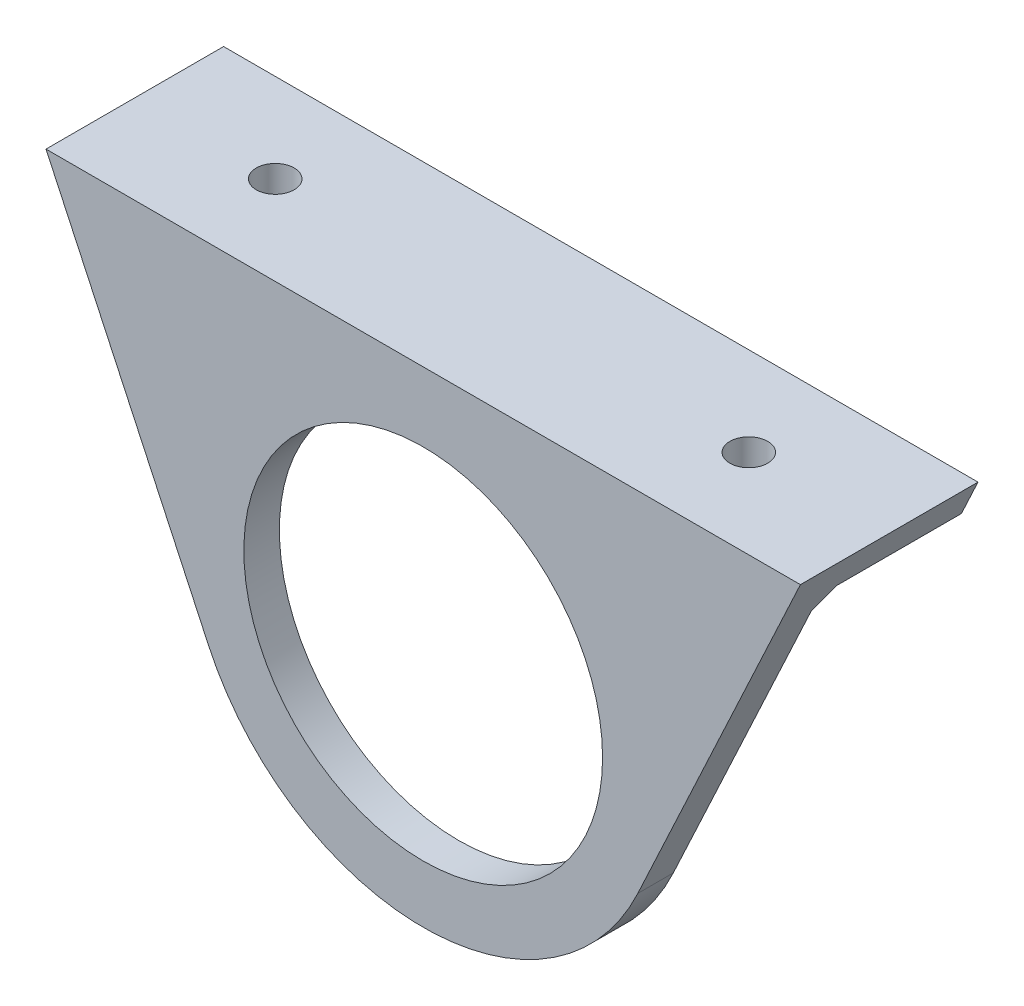
ISO-10303-21;
HEADER;
FILE_DESCRIPTION(('STEP AP214'),'2;1');
FILE_NAME('part.step','',(''),(''),'','','');
FILE_SCHEMA(('AUTOMOTIVE_DESIGN { 1 0 10303 214 1 1 1 1 }'));
ENDSEC;
DATA;
#1=APPLICATION_CONTEXT('core data for automotive mechanical design processes');
#2=APPLICATION_PROTOCOL_DEFINITION('international standard','automotive_design',2000,#1);
#3=PRODUCT_CONTEXT('',#1,'mechanical');
#4=PRODUCT('Part','Part','',(#3));
#5=PRODUCT_RELATED_PRODUCT_CATEGORY('part','',(#4));
#6=PRODUCT_DEFINITION_FORMATION('','',#4);
#7=PRODUCT_DEFINITION_CONTEXT('part definition',#1,'design');
#8=PRODUCT_DEFINITION('design','',#6,#7);
#9=PRODUCT_DEFINITION_SHAPE('','',#8);
#10=(LENGTH_UNIT() NAMED_UNIT(*) SI_UNIT(.MILLI.,.METRE.));
#11=(NAMED_UNIT(*) PLANE_ANGLE_UNIT() SI_UNIT($,.RADIAN.));
#12=(NAMED_UNIT(*) SI_UNIT($,.STERADIAN.) SOLID_ANGLE_UNIT());
#13=UNCERTAINTY_MEASURE_WITH_UNIT(LENGTH_MEASURE(1.E-05),#10,'distance_accuracy_value','');
#14=(GEOMETRIC_REPRESENTATION_CONTEXT(3) GLOBAL_UNCERTAINTY_ASSIGNED_CONTEXT((#13)) GLOBAL_UNIT_ASSIGNED_CONTEXT((#10,
#11,#12)) REPRESENTATION_CONTEXT('',''));
#15=CARTESIAN_POINT('',(0.,0.,0.));
#16=DIRECTION('',(0.,0.,1.));
#17=DIRECTION('',(1.,0.,0.));
#18=AXIS2_PLACEMENT_3D('',#15,#16,#17);
#19=CARTESIAN_POINT('',(0.,0.,15.));
#20=DIRECTION('',(0.,0.,1.));
#21=DIRECTION('',(1.,0.,0.));
#22=AXIS2_PLACEMENT_3D('',#19,#20,#21);
#23=PLANE('',#22);
#24=CARTESIAN_POINT('',(0.,0.,15.));
#25=DIRECTION('',(0.,0.,1.));
#26=DIRECTION('',(1.,0.,0.));
#27=AXIS2_PLACEMENT_3D('',#24,#25,#26);
#28=CIRCLE('',#27,20.);
#29=CARTESIAN_POINT('',(-18.126155740733,-8.45236523481408,15.));
#30=VERTEX_POINT('',#29);
#31=CARTESIAN_POINT('',(18.126155740733,-8.45236523481408,15.));
#32=VERTEX_POINT('',#31);
#33=EDGE_CURVE('E129',#30,#32,#28,.T.);
#34=ORIENTED_EDGE('',*,*,#33,.T.);
#35=DIRECTION('',(0.422618261740704,0.906307787036648,0.));
#36=VECTOR('',#35,1.);
#37=CARTESIAN_POINT('',(18.126155740733,-8.45236523481408,15.));
#38=LINE('',#37,#36);
#39=CARTESIAN_POINT('',(31.860019200505,21.,15.));
#40=VERTEX_POINT('',#39);
#41=EDGE_CURVE('E178',#32,#40,#38,.T.);
#42=ORIENTED_EDGE('',*,*,#41,.T.);
#43=DIRECTION('',(-1.,0.,0.));
#44=VECTOR('',#43,1.);
#45=CARTESIAN_POINT('',(-31.860019200505,21.,15.));
#46=LINE('',#45,#44);
#47=CARTESIAN_POINT('',(-31.860019200505,21.,15.));
#48=VERTEX_POINT('',#47);
#49=EDGE_CURVE('E139',#40,#48,#46,.T.);
#50=ORIENTED_EDGE('',*,*,#49,.T.);
#51=DIRECTION('',(0.422618261740704,-0.906307787036648,0.));
#52=VECTOR('',#51,1.);
#53=CARTESIAN_POINT('',(-18.126155740733,-8.45236523481408,15.));
#54=LINE('',#53,#52);
#55=EDGE_CURVE('E132',#48,#30,#54,.T.);
#56=ORIENTED_EDGE('',*,*,#55,.T.);
#57=EDGE_LOOP('',(#34,#42,#50,#56));
#58=FACE_BOUND('',#57,.T.);
#59=CARTESIAN_POINT('',(0.,0.,15.));
#60=DIRECTION('',(0.,0.,1.));
#61=DIRECTION('',(1.,0.,0.));
#62=AXIS2_PLACEMENT_3D('',#59,#60,#61);
#63=CIRCLE('',#62,15.15);
#64=CARTESIAN_POINT('',(15.15,0.,15.));
#65=VERTEX_POINT('',#64);
#66=EDGE_CURVE('E169',#65,#65,#63,.T.);
#67=ORIENTED_EDGE('',*,*,#66,.F.);
#68=EDGE_LOOP('',(#67));
#69=FACE_BOUND('',#68,.T.);
#70=ADVANCED_FACE('F45',(#58,#69),#23,.T.);
#71=CARTESIAN_POINT('',(0.,0.,0.));
#72=DIRECTION('',(0.,0.,1.));
#73=DIRECTION('',(1.,0.,0.));
#74=AXIS2_PLACEMENT_3D('',#71,#72,#73);
#75=PLANE('',#74);
#76=DIRECTION('',(0.422618261740704,0.906307787036648,0.));
#77=VECTOR('',#76,1.);
#78=CARTESIAN_POINT('',(18.126155740733,-8.45236523481408,0.));
#79=LINE('',#78,#77);
#80=CARTESIAN_POINT('',(30.46109622604,18.,0.));
#81=VERTEX_POINT('',#80);
#82=CARTESIAN_POINT('',(31.860019200505,21.,0.));
#83=VERTEX_POINT('',#82);
#84=EDGE_CURVE('E175',#81,#83,#79,.T.);
#85=ORIENTED_EDGE('',*,*,#84,.F.);
#86=DIRECTION('',(1.,0.,0.));
#87=VECTOR('',#86,1.);
#88=CARTESIAN_POINT('',(-35.,18.,0.));
#89=LINE('',#88,#87);
#90=CARTESIAN_POINT('',(-30.46109622604,18.,0.));
#91=VERTEX_POINT('',#90);
#92=EDGE_CURVE('E155',#91,#81,#89,.T.);
#93=ORIENTED_EDGE('',*,*,#92,.F.);
#94=DIRECTION('',(0.422618261740704,-0.906307787036648,0.));
#95=VECTOR('',#94,1.);
#96=CARTESIAN_POINT('',(-18.126155740733,-8.45236523481408,0.));
#97=LINE('',#96,#95);
#98=CARTESIAN_POINT('',(-31.860019200505,21.,0.));
#99=VERTEX_POINT('',#98);
#100=EDGE_CURVE('E142',#99,#91,#97,.T.);
#101=ORIENTED_EDGE('',*,*,#100,.F.);
#102=DIRECTION('',(-1.,0.,0.));
#103=VECTOR('',#102,1.);
#104=CARTESIAN_POINT('',(-31.860019200505,21.,0.));
#105=LINE('',#104,#103);
#106=EDGE_CURVE('E184',#83,#99,#105,.T.);
#107=ORIENTED_EDGE('',*,*,#106,.F.);
#108=EDGE_LOOP('',(#85,#93,#101,#107));
#109=FACE_BOUND('',#108,.T.);
#110=ADVANCED_FACE('F195',(#109),#75,.F.);
#111=CARTESIAN_POINT('',(0.,0.,15.));
#112=DIRECTION('',(0.,0.,-1.));
#113=DIRECTION('',(-1.,0.,0.));
#114=AXIS2_PLACEMENT_3D('',#111,#112,#113);
#115=CYLINDRICAL_SURFACE('',#114,20.);
#116=DIRECTION('',(0.,0.,-1.));
#117=VECTOR('',#116,1.);
#118=CARTESIAN_POINT('',(-18.126155740733,-8.45236523481408,15.));
#119=LINE('',#118,#117);
#120=CARTESIAN_POINT('',(-18.126155740733,-8.45236523481408,12.));
#121=VERTEX_POINT('',#120);
#122=EDGE_CURVE('E109',#30,#121,#119,.T.);
#123=ORIENTED_EDGE('',*,*,#122,.T.);
#124=CARTESIAN_POINT('',(0.,0.,12.));
#125=DIRECTION('',(0.,0.,1.));
#126=DIRECTION('',(0.,-1.,0.));
#127=AXIS2_PLACEMENT_3D('',#124,#125,#126);
#128=CIRCLE('',#127,20.);
#129=CARTESIAN_POINT('',(18.126155740733,-8.45236523481408,12.));
#130=VERTEX_POINT('',#129);
#131=EDGE_CURVE('E116',#121,#130,#128,.T.);
#132=ORIENTED_EDGE('',*,*,#131,.T.);
#133=DIRECTION('',(0.,0.,-1.));
#134=VECTOR('',#133,1.);
#135=CARTESIAN_POINT('',(18.126155740733,-8.45236523481408,15.));
#136=LINE('',#135,#134);
#137=EDGE_CURVE('E148',#32,#130,#136,.T.);
#138=ORIENTED_EDGE('',*,*,#137,.F.);
#139=ORIENTED_EDGE('',*,*,#33,.F.);
#140=EDGE_LOOP('',(#123,#132,#138,#139));
#141=FACE_BOUND('',#140,.T.);
#142=ADVANCED_FACE('F127',(#141),#115,.T.);
#143=CARTESIAN_POINT('',(18.126155740733,-8.45236523481408,15.));
#144=DIRECTION('',(-0.906307787036648,0.422618261740704,0.));
#145=DIRECTION('',(-0.422618261740704,-0.906307787036648,0.));
#146=AXIS2_PLACEMENT_3D('',#143,#144,#145);
#147=PLANE('',#146);
#148=ORIENTED_EDGE('',*,*,#137,.T.);
#149=DIRECTION('',(0.422618261740704,0.906307787036648,0.));
#150=VECTOR('',#149,1.);
#151=CARTESIAN_POINT('',(18.126155740733,-8.45236523481408,12.));
#152=LINE('',#151,#150);
#153=CARTESIAN_POINT('',(29.7616347388075,16.5,12.));
#154=VERTEX_POINT('',#153);
#155=EDGE_CURVE('E121',#130,#154,#152,.T.);
#156=ORIENTED_EDGE('',*,*,#155,.T.);
#157=DIRECTION('',(-0.31314561301498,-0.671542934237823,0.67154293423781));
#158=VECTOR('',#157,1.);
#159=CARTESIAN_POINT('',(22.7425345152546,1.44749099484088,27.0525090051588));
#160=LINE('',#159,#158);
#161=CARTESIAN_POINT('',(30.46109622604,18.,10.5));
#162=VERTEX_POINT('',#161);
#163=EDGE_CURVE('E55',#154,#162,#160,.F.);
#164=ORIENTED_EDGE('',*,*,#163,.T.);
#165=DIRECTION('',(0.,0.,-1.));
#166=VECTOR('',#165,1.);
#167=CARTESIAN_POINT('',(30.46109622604,18.,15.));
#168=LINE('',#167,#166);
#169=EDGE_CURVE('E166',#162,#81,#168,.T.);
#170=ORIENTED_EDGE('',*,*,#169,.T.);
#171=ORIENTED_EDGE('',*,*,#84,.T.);
#172=DIRECTION('',(0.,0.,-1.));
#173=VECTOR('',#172,1.);
#174=CARTESIAN_POINT('',(31.860019200505,21.,15.));
#175=LINE('',#174,#173);
#176=EDGE_CURVE('E137',#40,#83,#175,.T.);
#177=ORIENTED_EDGE('',*,*,#176,.F.);
#178=ORIENTED_EDGE('',*,*,#41,.F.);
#179=EDGE_LOOP('',(#148,#156,#164,#170,#171,#177,#178));
#180=FACE_BOUND('',#179,.T.);
#181=ADVANCED_FACE('F164',(#180),#147,.F.);
#182=CARTESIAN_POINT('',(-31.860019200505,21.,15.));
#183=DIRECTION('',(0.,-1.,0.));
#184=DIRECTION('',(0.,0.,-1.));
#185=AXIS2_PLACEMENT_3D('',#182,#183,#184);
#186=PLANE('',#185);
#187=CARTESIAN_POINT('',(-20.,21.,7.5));
#188=DIRECTION('',(0.,1.,0.));
#189=DIRECTION('',(0.,0.,1.));
#190=AXIS2_PLACEMENT_3D('',#187,#188,#189);
#191=CIRCLE('',#190,1.6);
#192=CARTESIAN_POINT('',(-20.,21.,9.1));
#193=VERTEX_POINT('',#192);
#194=EDGE_CURVE('E202',#193,#193,#191,.T.);
#195=ORIENTED_EDGE('',*,*,#194,.F.);
#196=EDGE_LOOP('',(#195));
#197=FACE_BOUND('',#196,.T.);
#198=CARTESIAN_POINT('',(20.,21.,7.5));
#199=DIRECTION('',(0.,1.,0.));
#200=DIRECTION('',(0.,0.,1.));
#201=AXIS2_PLACEMENT_3D('',#198,#199,#200);
#202=CIRCLE('',#201,1.6);
#203=CARTESIAN_POINT('',(20.,21.,9.1));
#204=VERTEX_POINT('',#203);
#205=EDGE_CURVE('E205',#204,#204,#202,.T.);
#206=ORIENTED_EDGE('',*,*,#205,.F.);
#207=EDGE_LOOP('',(#206));
#208=FACE_BOUND('',#207,.T.);
#209=ORIENTED_EDGE('',*,*,#106,.T.);
#210=DIRECTION('',(0.,0.,-1.));
#211=VECTOR('',#210,1.);
#212=CARTESIAN_POINT('',(-31.860019200505,21.,15.));
#213=LINE('',#212,#211);
#214=EDGE_CURVE('E131',#48,#99,#213,.T.);
#215=ORIENTED_EDGE('',*,*,#214,.F.);
#216=ORIENTED_EDGE('',*,*,#49,.F.);
#217=ORIENTED_EDGE('',*,*,#176,.T.);
#218=EDGE_LOOP('',(#209,#215,#216,#217));
#219=FACE_BOUND('',#218,.T.);
#220=ADVANCED_FACE('F220',(#197,#208,#219),#186,.F.);
#221=CARTESIAN_POINT('',(-18.126155740733,-8.45236523481408,15.));
#222=DIRECTION('',(0.906307787036648,0.422618261740704,0.));
#223=DIRECTION('',(-0.422618261740704,0.906307787036648,0.));
#224=AXIS2_PLACEMENT_3D('',#221,#222,#223);
#225=PLANE('',#224);
#226=DIRECTION('',(0.,0.,1.));
#227=VECTOR('',#226,1.);
#228=CARTESIAN_POINT('',(-30.46109622604,18.,15.));
#229=LINE('',#228,#227);
#230=CARTESIAN_POINT('',(-30.46109622604,18.,10.5));
#231=VERTEX_POINT('',#230);
#232=EDGE_CURVE('E151',#91,#231,#229,.T.);
#233=ORIENTED_EDGE('',*,*,#232,.T.);
#234=DIRECTION('',(-0.31314561301498,0.671542934237823,-0.67154293423781));
#235=VECTOR('',#234,1.);
#236=CARTESIAN_POINT('',(-22.7425345152546,1.44749099484088,27.0525090051588));
#237=LINE('',#236,#235);
#238=CARTESIAN_POINT('',(-29.7616347388075,16.5,12.));
#239=VERTEX_POINT('',#238);
#240=EDGE_CURVE('E11',#231,#239,#237,.F.);
#241=ORIENTED_EDGE('',*,*,#240,.T.);
#242=DIRECTION('',(0.422618261740704,-0.906307787036648,0.));
#243=VECTOR('',#242,1.);
#244=CARTESIAN_POINT('',(-18.126155740733,-8.45236523481408,12.));
#245=LINE('',#244,#243);
#246=EDGE_CURVE('E104',#239,#121,#245,.T.);
#247=ORIENTED_EDGE('',*,*,#246,.T.);
#248=ORIENTED_EDGE('',*,*,#122,.F.);
#249=ORIENTED_EDGE('',*,*,#55,.F.);
#250=ORIENTED_EDGE('',*,*,#214,.T.);
#251=ORIENTED_EDGE('',*,*,#100,.T.);
#252=EDGE_LOOP('',(#233,#241,#247,#248,#249,#250,#251));
#253=FACE_BOUND('',#252,.T.);
#254=ADVANCED_FACE('F106',(#253),#225,.F.);
#255=CARTESIAN_POINT('',(0.,0.,15.));
#256=DIRECTION('',(0.,0.,-1.));
#257=DIRECTION('',(-1.,0.,0.));
#258=AXIS2_PLACEMENT_3D('',#255,#256,#257);
#259=CYLINDRICAL_SURFACE('',#258,15.15);
#260=CARTESIAN_POINT('',(0.,0.,12.));
#261=DIRECTION('',(0.,0.,1.));
#262=DIRECTION('',(0.,-1.,0.));
#263=AXIS2_PLACEMENT_3D('',#260,#261,#262);
#264=CIRCLE('',#263,15.15);
#265=CARTESIAN_POINT('',(0.,-15.15,12.));
#266=VERTEX_POINT('',#265);
#267=EDGE_CURVE('E117',#266,#266,#264,.T.);
#268=ORIENTED_EDGE('',*,*,#267,.F.);
#269=EDGE_LOOP('',(#268));
#270=FACE_BOUND('',#269,.T.);
#271=ORIENTED_EDGE('',*,*,#66,.T.);
#272=EDGE_LOOP('',(#271));
#273=FACE_BOUND('',#272,.T.);
#274=ADVANCED_FACE('F234',(#270,#273),#259,.F.);
#275=CARTESIAN_POINT('',(-35.,18.,0.));
#276=DIRECTION('',(0.,1.,0.));
#277=DIRECTION('',(0.,0.,1.));
#278=AXIS2_PLACEMENT_3D('',#275,#276,#277);
#279=PLANE('',#278);
#280=CARTESIAN_POINT('',(-20.,18.,7.5));
#281=DIRECTION('',(0.,1.,0.));
#282=DIRECTION('',(0.,0.,1.));
#283=AXIS2_PLACEMENT_3D('',#280,#281,#282);
#284=CIRCLE('',#283,1.6);
#285=CARTESIAN_POINT('',(-20.,18.,9.1));
#286=VERTEX_POINT('',#285);
#287=EDGE_CURVE('E198',#286,#286,#284,.F.);
#288=ORIENTED_EDGE('',*,*,#287,.F.);
#289=EDGE_LOOP('',(#288));
#290=FACE_BOUND('',#289,.T.);
#291=CARTESIAN_POINT('',(20.,18.,7.5));
#292=DIRECTION('',(0.,1.,0.));
#293=DIRECTION('',(0.,0.,1.));
#294=AXIS2_PLACEMENT_3D('',#291,#292,#293);
#295=CIRCLE('',#294,1.6);
#296=CARTESIAN_POINT('',(20.,18.,9.1));
#297=VERTEX_POINT('',#296);
#298=EDGE_CURVE('E209',#297,#297,#295,.F.);
#299=ORIENTED_EDGE('',*,*,#298,.F.);
#300=EDGE_LOOP('',(#299));
#301=FACE_BOUND('',#300,.T.);
#302=ORIENTED_EDGE('',*,*,#169,.F.);
#303=DIRECTION('',(-1.,0.,0.));
#304=VECTOR('',#303,1.);
#305=CARTESIAN_POINT('',(-30.46109622604,18.,10.5));
#306=LINE('',#305,#304);
#307=EDGE_CURVE('E68',#162,#231,#306,.T.);
#308=ORIENTED_EDGE('',*,*,#307,.T.);
#309=ORIENTED_EDGE('',*,*,#232,.F.);
#310=ORIENTED_EDGE('',*,*,#92,.T.);
#311=EDGE_LOOP('',(#302,#308,#309,#310));
#312=FACE_BOUND('',#311,.T.);
#313=ADVANCED_FACE('F232',(#290,#301,#312),#279,.F.);
#314=CARTESIAN_POINT('',(-35.,18.,12.));
#315=DIRECTION('',(0.,0.,1.));
#316=DIRECTION('',(0.,-1.,0.));
#317=AXIS2_PLACEMENT_3D('',#314,#315,#316);
#318=PLANE('',#317);
#319=ORIENTED_EDGE('',*,*,#267,.T.);
#320=EDGE_LOOP('',(#319));
#321=FACE_BOUND('',#320,.T.);
#322=ORIENTED_EDGE('',*,*,#246,.F.);
#323=DIRECTION('',(1.,0.,0.));
#324=VECTOR('',#323,1.);
#325=CARTESIAN_POINT('',(30.46109622604,16.5,12.));
#326=LINE('',#325,#324);
#327=EDGE_CURVE('E158',#239,#154,#326,.T.);
#328=ORIENTED_EDGE('',*,*,#327,.T.);
#329=ORIENTED_EDGE('',*,*,#155,.F.);
#330=ORIENTED_EDGE('',*,*,#131,.F.);
#331=EDGE_LOOP('',(#322,#328,#329,#330));
#332=FACE_BOUND('',#331,.T.);
#333=ADVANCED_FACE('F120',(#321,#332),#318,.F.);
#334=CARTESIAN_POINT('',(20.,-20.001,7.5));
#335=DIRECTION('',(0.,1.,0.));
#336=DIRECTION('',(0.,0.,1.));
#337=AXIS2_PLACEMENT_3D('',#334,#335,#336);
#338=CYLINDRICAL_SURFACE('',#337,1.6);
#339=ORIENTED_EDGE('',*,*,#205,.T.);
#340=EDGE_LOOP('',(#339));
#341=FACE_BOUND('',#340,.T.);
#342=ORIENTED_EDGE('',*,*,#298,.T.);
#343=EDGE_LOOP('',(#342));
#344=FACE_BOUND('',#343,.T.);
#345=ADVANCED_FACE('F226',(#341,#344),#338,.F.);
#346=CARTESIAN_POINT('',(-20.,-20.001,7.5));
#347=DIRECTION('',(0.,1.,0.));
#348=DIRECTION('',(0.,0.,1.));
#349=AXIS2_PLACEMENT_3D('',#346,#347,#348);
#350=CYLINDRICAL_SURFACE('',#349,1.6);
#351=ORIENTED_EDGE('',*,*,#194,.T.);
#352=EDGE_LOOP('',(#351));
#353=FACE_BOUND('',#352,.T.);
#354=ORIENTED_EDGE('',*,*,#287,.T.);
#355=EDGE_LOOP('',(#354));
#356=FACE_BOUND('',#355,.T.);
#357=ADVANCED_FACE('F217',(#353,#356),#350,.F.);
#358=CARTESIAN_POINT('',(-35.,16.5,12.));
#359=DIRECTION('',(0.,-0.707106781186541,-0.707106781186554));
#360=DIRECTION('',(-1.,0.,0.));
#361=AXIS2_PLACEMENT_3D('',#358,#359,#360);
#362=PLANE('',#361);
#363=ORIENTED_EDGE('',*,*,#240,.F.);
#364=ORIENTED_EDGE('',*,*,#307,.F.);
#365=ORIENTED_EDGE('',*,*,#163,.F.);
#366=ORIENTED_EDGE('',*,*,#327,.F.);
#367=EDGE_LOOP('',(#363,#364,#365,#366));
#368=FACE_BOUND('',#367,.T.);
#369=ADVANCED_FACE('F48',(#368),#362,.T.);
#370=CLOSED_SHELL('',(#70,#110,#142,#181,#220,#254,#274,#313,#333,#345,#357,#369));
#371=MANIFOLD_SOLID_BREP('B2',#370);
#372=ADVANCED_BREP_SHAPE_REPRESENTATION('',(#18,#371),#14);
#373=SHAPE_DEFINITION_REPRESENTATION(#9,#372);
ENDSEC;
END-ISO-10303-21;
